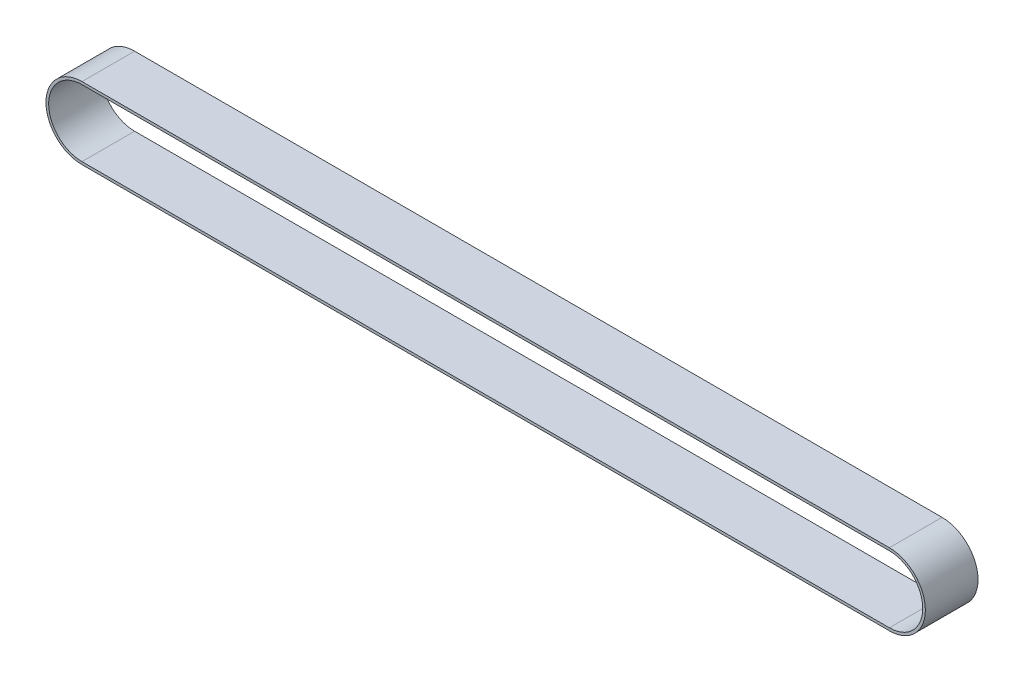
ISO-10303-21;
HEADER;
FILE_DESCRIPTION(('STEP AP214'),'2;1');
FILE_NAME('part.step','',(''),(''),'','','');
FILE_SCHEMA(('AUTOMOTIVE_DESIGN { 1 0 10303 214 1 1 1 1 }'));
ENDSEC;
DATA;
#1=APPLICATION_CONTEXT('core data for automotive mechanical design processes');
#2=APPLICATION_PROTOCOL_DEFINITION('international standard','automotive_design',2000,#1);
#3=PRODUCT_CONTEXT('',#1,'mechanical');
#4=PRODUCT('Part','Part','',(#3));
#5=PRODUCT_RELATED_PRODUCT_CATEGORY('part','',(#4));
#6=PRODUCT_DEFINITION_FORMATION('','',#4);
#7=PRODUCT_DEFINITION_CONTEXT('part definition',#1,'design');
#8=PRODUCT_DEFINITION('design','',#6,#7);
#9=PRODUCT_DEFINITION_SHAPE('','',#8);
#10=(LENGTH_UNIT() NAMED_UNIT(*) SI_UNIT(.MILLI.,.METRE.));
#11=(NAMED_UNIT(*) PLANE_ANGLE_UNIT() SI_UNIT($,.RADIAN.));
#12=(NAMED_UNIT(*) SI_UNIT($,.STERADIAN.) SOLID_ANGLE_UNIT());
#13=UNCERTAINTY_MEASURE_WITH_UNIT(LENGTH_MEASURE(1.E-05),#10,'distance_accuracy_value','');
#14=(GEOMETRIC_REPRESENTATION_CONTEXT(3) GLOBAL_UNCERTAINTY_ASSIGNED_CONTEXT((#13)) GLOBAL_UNIT_ASSIGNED_CONTEXT((#10,
#11,#12)) REPRESENTATION_CONTEXT('',''));
#15=CARTESIAN_POINT('',(0.,0.,0.));
#16=DIRECTION('',(0.,0.,1.));
#17=DIRECTION('',(1.,0.,0.));
#18=AXIS2_PLACEMENT_3D('',#15,#16,#17);
#19=CARTESIAN_POINT('',(0.,0.,30.));
#20=DIRECTION('',(0.,0.,1.));
#21=DIRECTION('',(1.,0.,0.));
#22=AXIS2_PLACEMENT_3D('',#19,#20,#21);
#23=PLANE('',#22);
#24=CARTESIAN_POINT('',(0.,0.,30.));
#25=DIRECTION('',(0.,0.,1.));
#26=DIRECTION('',(1.,0.,0.));
#27=AXIS2_PLACEMENT_3D('',#24,#25,#26);
#28=CIRCLE('',#27,20.5);
#29=CARTESIAN_POINT('',(0.,20.5,30.));
#30=VERTEX_POINT('',#29);
#31=CARTESIAN_POINT('',(0.,-20.5,30.));
#32=VERTEX_POINT('',#31);
#33=EDGE_CURVE('E134',#30,#32,#28,.T.);
#34=ORIENTED_EDGE('',*,*,#33,.T.);
#35=DIRECTION('',(1.,0.,0.));
#36=VECTOR('',#35,1.);
#37=CARTESIAN_POINT('',(0.,-20.5,30.));
#38=LINE('',#37,#36);
#39=CARTESIAN_POINT('',(460.,-20.5,30.));
#40=VERTEX_POINT('',#39);
#41=EDGE_CURVE('E137',#32,#40,#38,.T.);
#42=ORIENTED_EDGE('',*,*,#41,.T.);
#43=CARTESIAN_POINT('',(460.,0.,30.));
#44=DIRECTION('',(0.,0.,1.));
#45=DIRECTION('',(1.,0.,0.));
#46=AXIS2_PLACEMENT_3D('',#43,#44,#45);
#47=CIRCLE('',#46,20.5);
#48=CARTESIAN_POINT('',(460.,20.5,30.));
#49=VERTEX_POINT('',#48);
#50=EDGE_CURVE('E140',#40,#49,#47,.T.);
#51=ORIENTED_EDGE('',*,*,#50,.T.);
#52=DIRECTION('',(-1.,0.,0.));
#53=VECTOR('',#52,1.);
#54=CARTESIAN_POINT('',(0.,20.5,30.));
#55=LINE('',#54,#53);
#56=EDGE_CURVE('E142',#49,#30,#55,.T.);
#57=ORIENTED_EDGE('',*,*,#56,.T.);
#58=EDGE_LOOP('',(#34,#42,#51,#57));
#59=FACE_BOUND('',#58,.T.);
#60=DIRECTION('',(1.,0.,0.));
#61=VECTOR('',#60,1.);
#62=CARTESIAN_POINT('',(0.,-19.,30.));
#63=LINE('',#62,#61);
#64=CARTESIAN_POINT('',(0.,-19.,30.));
#65=VERTEX_POINT('',#64);
#66=CARTESIAN_POINT('',(460.,-19.,30.));
#67=VERTEX_POINT('',#66);
#68=EDGE_CURVE('E106',#65,#67,#63,.T.);
#69=ORIENTED_EDGE('',*,*,#68,.F.);
#70=CARTESIAN_POINT('',(0.,0.,30.));
#71=DIRECTION('',(0.,0.,1.));
#72=DIRECTION('',(1.,0.,0.));
#73=AXIS2_PLACEMENT_3D('',#70,#71,#72);
#74=CIRCLE('',#73,19.);
#75=CARTESIAN_POINT('',(0.,19.,30.));
#76=VERTEX_POINT('',#75);
#77=EDGE_CURVE('E98',#76,#65,#74,.T.);
#78=ORIENTED_EDGE('',*,*,#77,.F.);
#79=DIRECTION('',(-1.,0.,0.));
#80=VECTOR('',#79,1.);
#81=CARTESIAN_POINT('',(0.,19.,30.));
#82=LINE('',#81,#80);
#83=CARTESIAN_POINT('',(460.,19.,30.));
#84=VERTEX_POINT('',#83);
#85=EDGE_CURVE('E120',#84,#76,#82,.T.);
#86=ORIENTED_EDGE('',*,*,#85,.F.);
#87=CARTESIAN_POINT('',(460.,0.,30.));
#88=DIRECTION('',(0.,0.,1.));
#89=DIRECTION('',(1.,0.,0.));
#90=AXIS2_PLACEMENT_3D('',#87,#88,#89);
#91=CIRCLE('',#90,19.);
#92=EDGE_CURVE('E118',#67,#84,#91,.T.);
#93=ORIENTED_EDGE('',*,*,#92,.F.);
#94=EDGE_LOOP('',(#69,#78,#86,#93));
#95=FACE_BOUND('',#94,.T.);
#96=ADVANCED_FACE('F33',(#59,#95),#23,.T.);
#97=CARTESIAN_POINT('',(0.,0.,0.));
#98=DIRECTION('',(0.,0.,1.));
#99=DIRECTION('',(1.,0.,0.));
#100=AXIS2_PLACEMENT_3D('',#97,#98,#99);
#101=PLANE('',#100);
#102=CARTESIAN_POINT('',(0.,0.,0.));
#103=DIRECTION('',(0.,0.,1.));
#104=DIRECTION('',(1.,0.,0.));
#105=AXIS2_PLACEMENT_3D('',#102,#103,#104);
#106=CIRCLE('',#105,20.5);
#107=CARTESIAN_POINT('',(0.,20.5,0.));
#108=VERTEX_POINT('',#107);
#109=CARTESIAN_POINT('',(0.,-20.5,0.));
#110=VERTEX_POINT('',#109);
#111=EDGE_CURVE('E114',#108,#110,#106,.T.);
#112=ORIENTED_EDGE('',*,*,#111,.F.);
#113=DIRECTION('',(-1.,0.,0.));
#114=VECTOR('',#113,1.);
#115=CARTESIAN_POINT('',(0.,20.5,0.));
#116=LINE('',#115,#114);
#117=CARTESIAN_POINT('',(460.,20.5,0.));
#118=VERTEX_POINT('',#117);
#119=EDGE_CURVE('E138',#118,#108,#116,.T.);
#120=ORIENTED_EDGE('',*,*,#119,.F.);
#121=CARTESIAN_POINT('',(460.,0.,0.));
#122=DIRECTION('',(0.,0.,1.));
#123=DIRECTION('',(1.,0.,0.));
#124=AXIS2_PLACEMENT_3D('',#121,#122,#123);
#125=CIRCLE('',#124,20.5);
#126=CARTESIAN_POINT('',(460.,-20.5,0.));
#127=VERTEX_POINT('',#126);
#128=EDGE_CURVE('E149',#127,#118,#125,.T.);
#129=ORIENTED_EDGE('',*,*,#128,.F.);
#130=DIRECTION('',(1.,0.,0.));
#131=VECTOR('',#130,1.);
#132=CARTESIAN_POINT('',(0.,-20.5,0.));
#133=LINE('',#132,#131);
#134=EDGE_CURVE('E147',#110,#127,#133,.T.);
#135=ORIENTED_EDGE('',*,*,#134,.F.);
#136=EDGE_LOOP('',(#112,#120,#129,#135));
#137=FACE_BOUND('',#136,.T.);
#138=CARTESIAN_POINT('',(0.,0.,0.));
#139=DIRECTION('',(0.,0.,1.));
#140=DIRECTION('',(1.,0.,0.));
#141=AXIS2_PLACEMENT_3D('',#138,#139,#140);
#142=CIRCLE('',#141,19.);
#143=CARTESIAN_POINT('',(0.,19.,0.));
#144=VERTEX_POINT('',#143);
#145=CARTESIAN_POINT('',(0.,-19.,0.));
#146=VERTEX_POINT('',#145);
#147=EDGE_CURVE('E56',#144,#146,#142,.T.);
#148=ORIENTED_EDGE('',*,*,#147,.T.);
#149=DIRECTION('',(1.,0.,0.));
#150=VECTOR('',#149,1.);
#151=CARTESIAN_POINT('',(0.,-19.,0.));
#152=LINE('',#151,#150);
#153=CARTESIAN_POINT('',(460.,-19.,0.));
#154=VERTEX_POINT('',#153);
#155=EDGE_CURVE('E113',#146,#154,#152,.T.);
#156=ORIENTED_EDGE('',*,*,#155,.T.);
#157=CARTESIAN_POINT('',(460.,0.,0.));
#158=DIRECTION('',(0.,0.,1.));
#159=DIRECTION('',(1.,0.,0.));
#160=AXIS2_PLACEMENT_3D('',#157,#158,#159);
#161=CIRCLE('',#160,19.);
#162=CARTESIAN_POINT('',(460.,19.,0.));
#163=VERTEX_POINT('',#162);
#164=EDGE_CURVE('E126',#154,#163,#161,.T.);
#165=ORIENTED_EDGE('',*,*,#164,.T.);
#166=DIRECTION('',(-1.,0.,0.));
#167=VECTOR('',#166,1.);
#168=CARTESIAN_POINT('',(0.,19.,0.));
#169=LINE('',#168,#167);
#170=EDGE_CURVE('E107',#163,#144,#169,.T.);
#171=ORIENTED_EDGE('',*,*,#170,.T.);
#172=EDGE_LOOP('',(#148,#156,#165,#171));
#173=FACE_BOUND('',#172,.T.);
#174=ADVANCED_FACE('F167',(#137,#173),#101,.F.);
#175=CARTESIAN_POINT('',(0.,0.,30.));
#176=DIRECTION('',(0.,0.,-1.));
#177=DIRECTION('',(-1.,0.,0.));
#178=AXIS2_PLACEMENT_3D('',#175,#176,#177);
#179=CYLINDRICAL_SURFACE('',#178,20.5);
#180=ORIENTED_EDGE('',*,*,#111,.T.);
#181=DIRECTION('',(0.,0.,-1.));
#182=VECTOR('',#181,1.);
#183=CARTESIAN_POINT('',(0.,-20.5,30.));
#184=LINE('',#183,#182);
#185=EDGE_CURVE('E11',#32,#110,#184,.T.);
#186=ORIENTED_EDGE('',*,*,#185,.F.);
#187=ORIENTED_EDGE('',*,*,#33,.F.);
#188=DIRECTION('',(0.,0.,-1.));
#189=VECTOR('',#188,1.);
#190=CARTESIAN_POINT('',(0.,20.5,30.));
#191=LINE('',#190,#189);
#192=EDGE_CURVE('E144',#30,#108,#191,.T.);
#193=ORIENTED_EDGE('',*,*,#192,.T.);
#194=EDGE_LOOP('',(#180,#186,#187,#193));
#195=FACE_BOUND('',#194,.T.);
#196=ADVANCED_FACE('F35',(#195),#179,.T.);
#197=CARTESIAN_POINT('',(0.,-20.5,30.));
#198=DIRECTION('',(0.,1.,0.));
#199=DIRECTION('',(0.,0.,1.));
#200=AXIS2_PLACEMENT_3D('',#197,#198,#199);
#201=PLANE('',#200);
#202=ORIENTED_EDGE('',*,*,#134,.T.);
#203=DIRECTION('',(0.,0.,-1.));
#204=VECTOR('',#203,1.);
#205=CARTESIAN_POINT('',(460.,-20.5,30.));
#206=LINE('',#205,#204);
#207=EDGE_CURVE('E41',#40,#127,#206,.T.);
#208=ORIENTED_EDGE('',*,*,#207,.F.);
#209=ORIENTED_EDGE('',*,*,#41,.F.);
#210=ORIENTED_EDGE('',*,*,#185,.T.);
#211=EDGE_LOOP('',(#202,#208,#209,#210));
#212=FACE_BOUND('',#211,.T.);
#213=ADVANCED_FACE('F177',(#212),#201,.F.);
#214=CARTESIAN_POINT('',(460.,0.,30.));
#215=DIRECTION('',(0.,0.,-1.));
#216=DIRECTION('',(-1.,0.,0.));
#217=AXIS2_PLACEMENT_3D('',#214,#215,#216);
#218=CYLINDRICAL_SURFACE('',#217,20.5);
#219=ORIENTED_EDGE('',*,*,#128,.T.);
#220=DIRECTION('',(0.,0.,-1.));
#221=VECTOR('',#220,1.);
#222=CARTESIAN_POINT('',(460.,20.5,30.));
#223=LINE('',#222,#221);
#224=EDGE_CURVE('E154',#49,#118,#223,.T.);
#225=ORIENTED_EDGE('',*,*,#224,.F.);
#226=ORIENTED_EDGE('',*,*,#50,.F.);
#227=ORIENTED_EDGE('',*,*,#207,.T.);
#228=EDGE_LOOP('',(#219,#225,#226,#227));
#229=FACE_BOUND('',#228,.T.);
#230=ADVANCED_FACE('F161',(#229),#218,.T.);
#231=CARTESIAN_POINT('',(0.,20.5,30.));
#232=DIRECTION('',(0.,-1.,0.));
#233=DIRECTION('',(0.,0.,-1.));
#234=AXIS2_PLACEMENT_3D('',#231,#232,#233);
#235=PLANE('',#234);
#236=ORIENTED_EDGE('',*,*,#119,.T.);
#237=ORIENTED_EDGE('',*,*,#192,.F.);
#238=ORIENTED_EDGE('',*,*,#56,.F.);
#239=ORIENTED_EDGE('',*,*,#224,.T.);
#240=EDGE_LOOP('',(#236,#237,#238,#239));
#241=FACE_BOUND('',#240,.T.);
#242=ADVANCED_FACE('F171',(#241),#235,.F.);
#243=CARTESIAN_POINT('',(0.,0.,30.));
#244=DIRECTION('',(0.,0.,-1.));
#245=DIRECTION('',(-1.,0.,0.));
#246=AXIS2_PLACEMENT_3D('',#243,#244,#245);
#247=CYLINDRICAL_SURFACE('',#246,19.);
#248=ORIENTED_EDGE('',*,*,#147,.F.);
#249=DIRECTION('',(0.,0.,-1.));
#250=VECTOR('',#249,1.);
#251=CARTESIAN_POINT('',(0.,19.,30.));
#252=LINE('',#251,#250);
#253=EDGE_CURVE('E102',#76,#144,#252,.T.);
#254=ORIENTED_EDGE('',*,*,#253,.F.);
#255=ORIENTED_EDGE('',*,*,#77,.T.);
#256=DIRECTION('',(0.,0.,-1.));
#257=VECTOR('',#256,1.);
#258=CARTESIAN_POINT('',(0.,-19.,30.));
#259=LINE('',#258,#257);
#260=EDGE_CURVE('E101',#65,#146,#259,.T.);
#261=ORIENTED_EDGE('',*,*,#260,.T.);
#262=EDGE_LOOP('',(#248,#254,#255,#261));
#263=FACE_BOUND('',#262,.T.);
#264=ADVANCED_FACE('F100',(#263),#247,.F.);
#265=CARTESIAN_POINT('',(0.,-19.,30.));
#266=DIRECTION('',(0.,1.,0.));
#267=DIRECTION('',(0.,0.,1.));
#268=AXIS2_PLACEMENT_3D('',#265,#266,#267);
#269=PLANE('',#268);
#270=ORIENTED_EDGE('',*,*,#155,.F.);
#271=ORIENTED_EDGE('',*,*,#260,.F.);
#272=ORIENTED_EDGE('',*,*,#68,.T.);
#273=DIRECTION('',(0.,0.,-1.));
#274=VECTOR('',#273,1.);
#275=CARTESIAN_POINT('',(460.,-19.,30.));
#276=LINE('',#275,#274);
#277=EDGE_CURVE('E115',#67,#154,#276,.T.);
#278=ORIENTED_EDGE('',*,*,#277,.T.);
#279=EDGE_LOOP('',(#270,#271,#272,#278));
#280=FACE_BOUND('',#279,.T.);
#281=ADVANCED_FACE('F110',(#280),#269,.T.);
#282=CARTESIAN_POINT('',(460.,0.,30.));
#283=DIRECTION('',(0.,0.,-1.));
#284=DIRECTION('',(-1.,0.,0.));
#285=AXIS2_PLACEMENT_3D('',#282,#283,#284);
#286=CYLINDRICAL_SURFACE('',#285,19.);
#287=ORIENTED_EDGE('',*,*,#164,.F.);
#288=ORIENTED_EDGE('',*,*,#277,.F.);
#289=ORIENTED_EDGE('',*,*,#92,.T.);
#290=DIRECTION('',(0.,0.,-1.));
#291=VECTOR('',#290,1.);
#292=CARTESIAN_POINT('',(460.,19.,30.));
#293=LINE('',#292,#291);
#294=EDGE_CURVE('E48',#84,#163,#293,.T.);
#295=ORIENTED_EDGE('',*,*,#294,.T.);
#296=EDGE_LOOP('',(#287,#288,#289,#295));
#297=FACE_BOUND('',#296,.T.);
#298=ADVANCED_FACE('F200',(#297),#286,.F.);
#299=CARTESIAN_POINT('',(0.,19.,30.));
#300=DIRECTION('',(0.,-1.,0.));
#301=DIRECTION('',(0.,0.,-1.));
#302=AXIS2_PLACEMENT_3D('',#299,#300,#301);
#303=PLANE('',#302);
#304=ORIENTED_EDGE('',*,*,#170,.F.);
#305=ORIENTED_EDGE('',*,*,#294,.F.);
#306=ORIENTED_EDGE('',*,*,#85,.T.);
#307=ORIENTED_EDGE('',*,*,#253,.T.);
#308=EDGE_LOOP('',(#304,#305,#306,#307));
#309=FACE_BOUND('',#308,.T.);
#310=ADVANCED_FACE('F204',(#309),#303,.T.);
#311=CLOSED_SHELL('',(#96,#174,#196,#213,#230,#242,#264,#281,#298,#310));
#312=MANIFOLD_SOLID_BREP('B2',#311);
#313=ADVANCED_BREP_SHAPE_REPRESENTATION('',(#18,#312),#14);
#314=SHAPE_DEFINITION_REPRESENTATION(#9,#313);
ENDSEC;
END-ISO-10303-21;
